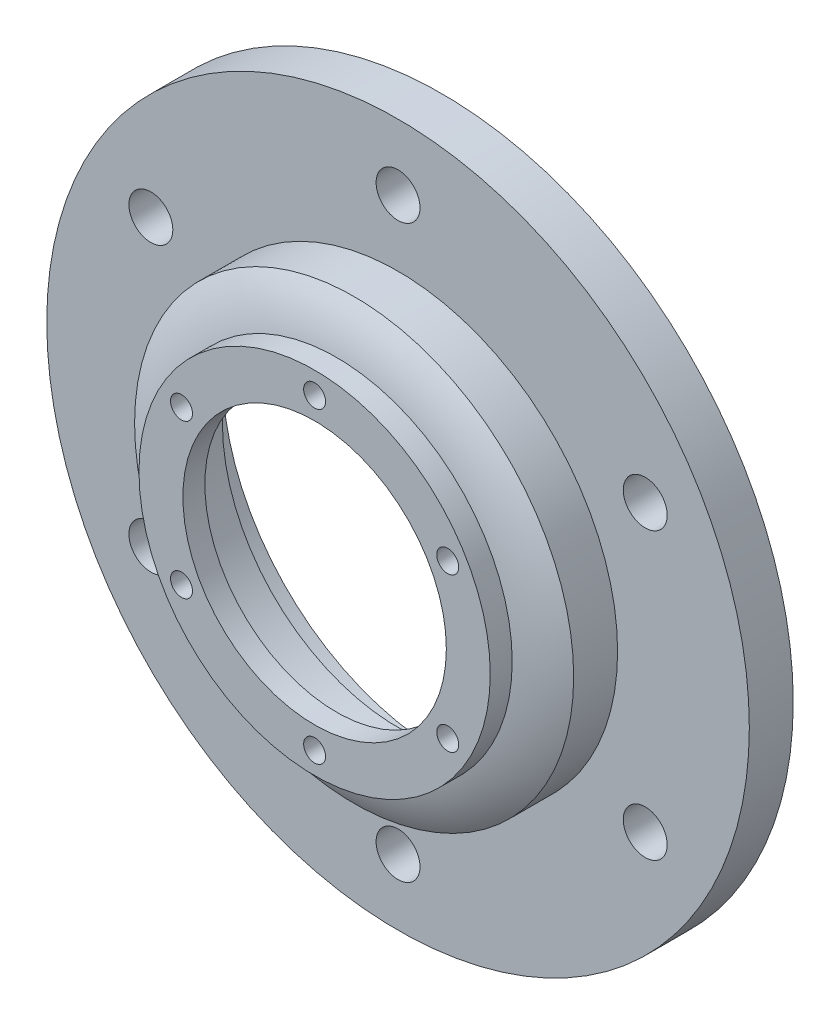
ISO-10303-21;
HEADER;
FILE_DESCRIPTION(('STEP AP214'),'2;1');
FILE_NAME('part.step','',(''),(''),'','','');
FILE_SCHEMA(('AUTOMOTIVE_DESIGN { 1 0 10303 214 1 1 1 1 }'));
ENDSEC;
DATA;
#1=APPLICATION_CONTEXT('core data for automotive mechanical design processes');
#2=APPLICATION_PROTOCOL_DEFINITION('international standard','automotive_design',2000,#1);
#3=PRODUCT_CONTEXT('',#1,'mechanical');
#4=PRODUCT('Part','Part','',(#3));
#5=PRODUCT_RELATED_PRODUCT_CATEGORY('part','',(#4));
#6=PRODUCT_DEFINITION_FORMATION('','',#4);
#7=PRODUCT_DEFINITION_CONTEXT('part definition',#1,'design');
#8=PRODUCT_DEFINITION('design','',#6,#7);
#9=PRODUCT_DEFINITION_SHAPE('','',#8);
#10=(LENGTH_UNIT() NAMED_UNIT(*) SI_UNIT(.MILLI.,.METRE.));
#11=(NAMED_UNIT(*) PLANE_ANGLE_UNIT() SI_UNIT($,.RADIAN.));
#12=(NAMED_UNIT(*) SI_UNIT($,.STERADIAN.) SOLID_ANGLE_UNIT());
#13=UNCERTAINTY_MEASURE_WITH_UNIT(LENGTH_MEASURE(1.E-05),#10,'distance_accuracy_value','');
#14=(GEOMETRIC_REPRESENTATION_CONTEXT(3) GLOBAL_UNCERTAINTY_ASSIGNED_CONTEXT((#13)) GLOBAL_UNIT_ASSIGNED_CONTEXT((#10,
#11,#12)) REPRESENTATION_CONTEXT('',''));
#15=CARTESIAN_POINT('',(0.,0.,0.));
#16=DIRECTION('',(0.,0.,1.));
#17=DIRECTION('',(1.,0.,0.));
#18=AXIS2_PLACEMENT_3D('',#15,#16,#17);
#19=CARTESIAN_POINT('',(0.,0.,29.));
#20=DIRECTION('',(0.,0.,1.));
#21=DIRECTION('',(1.,0.,0.));
#22=AXIS2_PLACEMENT_3D('',#19,#20,#21);
#23=PLANE('',#22);
#24=CARTESIAN_POINT('',(-30.3108891324552,17.5000000000004,29.));
#25=DIRECTION('',(0.,0.,1.));
#26=DIRECTION('',(1.,0.,0.));
#27=AXIS2_PLACEMENT_3D('',#24,#25,#26);
#28=CIRCLE('',#27,2.5);
#29=CARTESIAN_POINT('',(-27.8108891324551,17.5000000000004,29.));
#30=VERTEX_POINT('',#29);
#31=EDGE_CURVE('E97',#30,#30,#28,.T.);
#32=ORIENTED_EDGE('',*,*,#31,.F.);
#33=EDGE_LOOP('',(#32));
#34=FACE_BOUND('',#33,.T.);
#35=CARTESIAN_POINT('',(0.,35.,29.));
#36=DIRECTION('',(0.,0.,1.));
#37=DIRECTION('',(1.,0.,0.));
#38=AXIS2_PLACEMENT_3D('',#35,#36,#37);
#39=CIRCLE('',#38,2.5);
#40=CARTESIAN_POINT('',(2.5,35.,29.));
#41=VERTEX_POINT('',#40);
#42=EDGE_CURVE('E131',#41,#41,#39,.T.);
#43=ORIENTED_EDGE('',*,*,#42,.F.);
#44=EDGE_LOOP('',(#43));
#45=FACE_BOUND('',#44,.T.);
#46=CARTESIAN_POINT('',(30.3108891324554,17.4999999999999,29.));
#47=DIRECTION('',(0.,0.,1.));
#48=DIRECTION('',(1.,0.,0.));
#49=AXIS2_PLACEMENT_3D('',#46,#47,#48);
#50=CIRCLE('',#49,2.5);
#51=CARTESIAN_POINT('',(32.8108891324554,17.4999999999999,29.));
#52=VERTEX_POINT('',#51);
#53=EDGE_CURVE('E128',#52,#52,#50,.T.);
#54=ORIENTED_EDGE('',*,*,#53,.F.);
#55=EDGE_LOOP('',(#54));
#56=FACE_BOUND('',#55,.T.);
#57=CARTESIAN_POINT('',(30.3108891324553,-17.5000000000001,29.));
#58=DIRECTION('',(0.,0.,1.));
#59=DIRECTION('',(1.,0.,0.));
#60=AXIS2_PLACEMENT_3D('',#57,#58,#59);
#61=CIRCLE('',#60,2.5);
#62=CARTESIAN_POINT('',(32.8108891324553,-17.5000000000001,29.));
#63=VERTEX_POINT('',#62);
#64=EDGE_CURVE('E125',#63,#63,#61,.T.);
#65=ORIENTED_EDGE('',*,*,#64,.F.);
#66=EDGE_LOOP('',(#65));
#67=FACE_BOUND('',#66,.T.);
#68=CARTESIAN_POINT('',(-2.44403693719019E-13,-35.,29.));
#69=DIRECTION('',(0.,0.,1.));
#70=DIRECTION('',(1.,0.,0.));
#71=AXIS2_PLACEMENT_3D('',#68,#69,#70);
#72=CIRCLE('',#71,2.5);
#73=CARTESIAN_POINT('',(2.49999999999976,-35.,29.));
#74=VERTEX_POINT('',#73);
#75=EDGE_CURVE('E122',#74,#74,#72,.T.);
#76=ORIENTED_EDGE('',*,*,#75,.F.);
#77=EDGE_LOOP('',(#76));
#78=FACE_BOUND('',#77,.T.);
#79=CARTESIAN_POINT('',(-30.3108891324555,-17.4999999999997,29.));
#80=DIRECTION('',(0.,0.,1.));
#81=DIRECTION('',(1.,0.,0.));
#82=AXIS2_PLACEMENT_3D('',#79,#80,#81);
#83=CIRCLE('',#82,2.5);
#84=CARTESIAN_POINT('',(-27.8108891324555,-17.4999999999997,29.));
#85=VERTEX_POINT('',#84);
#86=EDGE_CURVE('E119',#85,#85,#83,.T.);
#87=ORIENTED_EDGE('',*,*,#86,.F.);
#88=EDGE_LOOP('',(#87));
#89=FACE_BOUND('',#88,.T.);
#90=CARTESIAN_POINT('',(0.,0.,29.));
#91=DIRECTION('',(0.,0.,1.));
#92=DIRECTION('',(1.,0.,0.));
#93=AXIS2_PLACEMENT_3D('',#90,#91,#92);
#94=CIRCLE('',#93,40.);
#95=CARTESIAN_POINT('',(40.,0.,29.));
#96=VERTEX_POINT('',#95);
#97=EDGE_CURVE('E12',#96,#96,#94,.T.);
#98=ORIENTED_EDGE('',*,*,#97,.T.);
#99=EDGE_LOOP('',(#98));
#100=FACE_BOUND('',#99,.T.);
#101=CARTESIAN_POINT('',(0.,0.,29.));
#102=DIRECTION('',(0.,0.,1.));
#103=DIRECTION('',(1.,0.,0.));
#104=AXIS2_PLACEMENT_3D('',#101,#102,#103);
#105=CIRCLE('',#104,30.);
#106=CARTESIAN_POINT('',(30.,0.,29.));
#107=VERTEX_POINT('',#106);
#108=EDGE_CURVE('E87',#107,#107,#105,.T.);
#109=ORIENTED_EDGE('',*,*,#108,.F.);
#110=EDGE_LOOP('',(#109));
#111=FACE_BOUND('',#110,.T.);
#112=ADVANCED_FACE('F74',(#34,#45,#56,#67,#78,#89,#100,#111),#23,.T.);
#113=CARTESIAN_POINT('',(0.,0.,24.));
#114=DIRECTION('',(0.,0.,1.));
#115=DIRECTION('',(1.,0.,0.));
#116=AXIS2_PLACEMENT_3D('',#113,#114,#115);
#117=PLANE('',#116);
#118=CARTESIAN_POINT('',(-30.3108891324552,17.5000000000004,24.));
#119=DIRECTION('',(0.,0.,1.));
#120=DIRECTION('',(1.,0.,0.));
#121=AXIS2_PLACEMENT_3D('',#118,#119,#120);
#122=CIRCLE('',#121,2.5);
#123=CARTESIAN_POINT('',(-27.8108891324551,17.5000000000004,24.));
#124=VERTEX_POINT('',#123);
#125=EDGE_CURVE('E78',#124,#124,#122,.T.);
#126=ORIENTED_EDGE('',*,*,#125,.T.);
#127=EDGE_LOOP('',(#126));
#128=FACE_BOUND('',#127,.T.);
#129=CARTESIAN_POINT('',(0.,35.,24.));
#130=DIRECTION('',(0.,0.,1.));
#131=DIRECTION('',(1.,0.,0.));
#132=AXIS2_PLACEMENT_3D('',#129,#130,#131);
#133=CIRCLE('',#132,2.5);
#134=CARTESIAN_POINT('',(2.5,35.,24.));
#135=VERTEX_POINT('',#134);
#136=EDGE_CURVE('E105',#135,#135,#133,.T.);
#137=ORIENTED_EDGE('',*,*,#136,.T.);
#138=EDGE_LOOP('',(#137));
#139=FACE_BOUND('',#138,.T.);
#140=CARTESIAN_POINT('',(30.3108891324554,17.4999999999999,24.));
#141=DIRECTION('',(0.,0.,1.));
#142=DIRECTION('',(1.,0.,0.));
#143=AXIS2_PLACEMENT_3D('',#140,#141,#142);
#144=CIRCLE('',#143,2.5);
#145=CARTESIAN_POINT('',(32.8108891324554,17.4999999999999,24.));
#146=VERTEX_POINT('',#145);
#147=EDGE_CURVE('E103',#146,#146,#144,.T.);
#148=ORIENTED_EDGE('',*,*,#147,.T.);
#149=EDGE_LOOP('',(#148));
#150=FACE_BOUND('',#149,.T.);
#151=CARTESIAN_POINT('',(30.3108891324553,-17.5000000000001,24.));
#152=DIRECTION('',(0.,0.,1.));
#153=DIRECTION('',(1.,0.,0.));
#154=AXIS2_PLACEMENT_3D('',#151,#152,#153);
#155=CIRCLE('',#154,2.5);
#156=CARTESIAN_POINT('',(32.8108891324553,-17.5000000000001,24.));
#157=VERTEX_POINT('',#156);
#158=EDGE_CURVE('E100',#157,#157,#155,.T.);
#159=ORIENTED_EDGE('',*,*,#158,.T.);
#160=EDGE_LOOP('',(#159));
#161=FACE_BOUND('',#160,.T.);
#162=CARTESIAN_POINT('',(-2.44403693719019E-13,-35.,24.));
#163=DIRECTION('',(0.,0.,1.));
#164=DIRECTION('',(1.,0.,0.));
#165=AXIS2_PLACEMENT_3D('',#162,#163,#164);
#166=CIRCLE('',#165,2.5);
#167=CARTESIAN_POINT('',(2.49999999999976,-35.,24.));
#168=VERTEX_POINT('',#167);
#169=EDGE_CURVE('E96',#168,#168,#166,.T.);
#170=ORIENTED_EDGE('',*,*,#169,.T.);
#171=EDGE_LOOP('',(#170));
#172=FACE_BOUND('',#171,.T.);
#173=CARTESIAN_POINT('',(-30.3108891324555,-17.4999999999997,24.));
#174=DIRECTION('',(0.,0.,1.));
#175=DIRECTION('',(1.,0.,0.));
#176=AXIS2_PLACEMENT_3D('',#173,#174,#175);
#177=CIRCLE('',#176,2.5);
#178=CARTESIAN_POINT('',(-27.8108891324555,-17.4999999999997,24.));
#179=VERTEX_POINT('',#178);
#180=EDGE_CURVE('E93',#179,#179,#177,.T.);
#181=ORIENTED_EDGE('',*,*,#180,.T.);
#182=EDGE_LOOP('',(#181));
#183=FACE_BOUND('',#182,.T.);
#184=CARTESIAN_POINT('',(0.,0.,24.));
#185=DIRECTION('',(0.,0.,1.));
#186=DIRECTION('',(1.,0.,0.));
#187=AXIS2_PLACEMENT_3D('',#184,#185,#186);
#188=CIRCLE('',#187,40.);
#189=CARTESIAN_POINT('',(40.,0.,24.));
#190=VERTEX_POINT('',#189);
#191=EDGE_CURVE('E82',#190,#190,#188,.T.);
#192=ORIENTED_EDGE('',*,*,#191,.F.);
#193=EDGE_LOOP('',(#192));
#194=FACE_BOUND('',#193,.T.);
#195=CARTESIAN_POINT('',(0.,0.,24.));
#196=DIRECTION('',(0.,0.,1.));
#197=DIRECTION('',(1.,0.,0.));
#198=AXIS2_PLACEMENT_3D('',#195,#196,#197);
#199=CIRCLE('',#198,30.);
#200=CARTESIAN_POINT('',(30.,0.,24.));
#201=VERTEX_POINT('',#200);
#202=EDGE_CURVE('E90',#201,#201,#199,.T.);
#203=ORIENTED_EDGE('',*,*,#202,.T.);
#204=EDGE_LOOP('',(#203));
#205=FACE_BOUND('',#204,.T.);
#206=ADVANCED_FACE('F142',(#128,#139,#150,#161,#172,#183,#194,#205),#117,.F.);
#207=CARTESIAN_POINT('',(0.,0.,29.));
#208=DIRECTION('',(0.,0.,-1.));
#209=DIRECTION('',(-1.,0.,0.));
#210=AXIS2_PLACEMENT_3D('',#207,#208,#209);
#211=CYLINDRICAL_SURFACE('',#210,40.);
#212=ORIENTED_EDGE('',*,*,#97,.F.);
#213=EDGE_LOOP('',(#212));
#214=FACE_BOUND('',#213,.T.);
#215=ORIENTED_EDGE('',*,*,#191,.T.);
#216=EDGE_LOOP('',(#215));
#217=FACE_BOUND('',#216,.T.);
#218=ADVANCED_FACE('F76',(#214,#217),#211,.T.);
#219=CARTESIAN_POINT('',(0.,0.,29.));
#220=DIRECTION('',(0.,0.,-1.));
#221=DIRECTION('',(-1.,0.,0.));
#222=AXIS2_PLACEMENT_3D('',#219,#220,#221);
#223=CYLINDRICAL_SURFACE('',#222,30.);
#224=ORIENTED_EDGE('',*,*,#108,.T.);
#225=EDGE_LOOP('',(#224));
#226=FACE_BOUND('',#225,.T.);
#227=ORIENTED_EDGE('',*,*,#202,.F.);
#228=EDGE_LOOP('',(#227));
#229=FACE_BOUND('',#228,.T.);
#230=ADVANCED_FACE('F159',(#226,#229),#223,.F.);
#231=CARTESIAN_POINT('',(-30.3108891324555,-17.4999999999997,0.));
#232=DIRECTION('',(0.,0.,1.));
#233=DIRECTION('',(1.,0.,0.));
#234=AXIS2_PLACEMENT_3D('',#231,#232,#233);
#235=CYLINDRICAL_SURFACE('',#234,2.5);
#236=ORIENTED_EDGE('',*,*,#86,.T.);
#237=EDGE_LOOP('',(#236));
#238=FACE_BOUND('',#237,.T.);
#239=ORIENTED_EDGE('',*,*,#180,.F.);
#240=EDGE_LOOP('',(#239));
#241=FACE_BOUND('',#240,.T.);
#242=ADVANCED_FACE('F155',(#238,#241),#235,.F.);
#243=CARTESIAN_POINT('',(-2.44403693719019E-13,-35.,0.));
#244=DIRECTION('',(0.,0.,1.));
#245=DIRECTION('',(1.,0.,0.));
#246=AXIS2_PLACEMENT_3D('',#243,#244,#245);
#247=CYLINDRICAL_SURFACE('',#246,2.5);
#248=ORIENTED_EDGE('',*,*,#75,.T.);
#249=EDGE_LOOP('',(#248));
#250=FACE_BOUND('',#249,.T.);
#251=ORIENTED_EDGE('',*,*,#169,.F.);
#252=EDGE_LOOP('',(#251));
#253=FACE_BOUND('',#252,.T.);
#254=ADVANCED_FACE('F158',(#250,#253),#247,.F.);
#255=CARTESIAN_POINT('',(30.3108891324553,-17.5000000000001,0.));
#256=DIRECTION('',(0.,0.,1.));
#257=DIRECTION('',(1.,0.,0.));
#258=AXIS2_PLACEMENT_3D('',#255,#256,#257);
#259=CYLINDRICAL_SURFACE('',#258,2.5);
#260=ORIENTED_EDGE('',*,*,#64,.T.);
#261=EDGE_LOOP('',(#260));
#262=FACE_BOUND('',#261,.T.);
#263=ORIENTED_EDGE('',*,*,#158,.F.);
#264=EDGE_LOOP('',(#263));
#265=FACE_BOUND('',#264,.T.);
#266=ADVANCED_FACE('F179',(#262,#265),#259,.F.);
#267=CARTESIAN_POINT('',(30.3108891324554,17.4999999999999,0.));
#268=DIRECTION('',(0.,0.,1.));
#269=DIRECTION('',(1.,0.,0.));
#270=AXIS2_PLACEMENT_3D('',#267,#268,#269);
#271=CYLINDRICAL_SURFACE('',#270,2.5);
#272=ORIENTED_EDGE('',*,*,#53,.T.);
#273=EDGE_LOOP('',(#272));
#274=FACE_BOUND('',#273,.T.);
#275=ORIENTED_EDGE('',*,*,#147,.F.);
#276=EDGE_LOOP('',(#275));
#277=FACE_BOUND('',#276,.T.);
#278=ADVANCED_FACE('F183',(#274,#277),#271,.F.);
#279=CARTESIAN_POINT('',(0.,35.,0.));
#280=DIRECTION('',(0.,0.,1.));
#281=DIRECTION('',(1.,0.,0.));
#282=AXIS2_PLACEMENT_3D('',#279,#280,#281);
#283=CYLINDRICAL_SURFACE('',#282,2.5);
#284=ORIENTED_EDGE('',*,*,#42,.T.);
#285=EDGE_LOOP('',(#284));
#286=FACE_BOUND('',#285,.T.);
#287=ORIENTED_EDGE('',*,*,#136,.F.);
#288=EDGE_LOOP('',(#287));
#289=FACE_BOUND('',#288,.T.);
#290=ADVANCED_FACE('F187',(#286,#289),#283,.F.);
#291=CARTESIAN_POINT('',(-30.3108891324552,17.5000000000004,0.));
#292=DIRECTION('',(0.,0.,1.));
#293=DIRECTION('',(1.,0.,0.));
#294=AXIS2_PLACEMENT_3D('',#291,#292,#293);
#295=CYLINDRICAL_SURFACE('',#294,2.5);
#296=ORIENTED_EDGE('',*,*,#31,.T.);
#297=EDGE_LOOP('',(#296));
#298=FACE_BOUND('',#297,.T.);
#299=ORIENTED_EDGE('',*,*,#125,.F.);
#300=EDGE_LOOP('',(#299));
#301=FACE_BOUND('',#300,.T.);
#302=ADVANCED_FACE('F137',(#298,#301),#295,.F.);
#303=CLOSED_SHELL('',(#112,#206,#218,#230,#242,#254,#266,#278,#290,#302));
#304=MANIFOLD_SOLID_BREP('B2',#303);
#305=CARTESIAN_POINT('',(0.,0.,10.));
#306=DIRECTION('',(0.,0.,1.));
#307=DIRECTION('',(1.,0.,0.));
#308=AXIS2_PLACEMENT_3D('',#305,#306,#307);
#309=PLANE('',#308);
#310=CARTESIAN_POINT('',(0.,0.,10.));
#311=DIRECTION('',(0.,0.,1.));
#312=DIRECTION('',(1.,0.,0.));
#313=AXIS2_PLACEMENT_3D('',#310,#311,#312);
#314=CIRCLE('',#313,50.);
#315=CARTESIAN_POINT('',(50.,0.,10.));
#316=VERTEX_POINT('',#315);
#317=EDGE_CURVE('E313',#316,#316,#314,.T.);
#318=ORIENTED_EDGE('',*,*,#317,.F.);
#319=EDGE_LOOP('',(#318));
#320=FACE_BOUND('',#319,.T.);
#321=CARTESIAN_POINT('',(0.,0.,10.));
#322=DIRECTION('',(0.,0.,1.));
#323=DIRECTION('',(1.,0.,0.));
#324=AXIS2_PLACEMENT_3D('',#321,#322,#323);
#325=CIRCLE('',#324,40.);
#326=CARTESIAN_POINT('',(40.,0.,10.));
#327=VERTEX_POINT('',#326);
#328=EDGE_CURVE('E320',#327,#327,#325,.T.);
#329=ORIENTED_EDGE('',*,*,#328,.T.);
#330=EDGE_LOOP('',(#329));
#331=FACE_BOUND('',#330,.T.);
#332=ADVANCED_FACE('F309',(#320,#331),#309,.F.);
#333=CARTESIAN_POINT('',(0.,0.,20.));
#334=DIRECTION('',(0.,0.,-1.));
#335=DIRECTION('',(-1.,0.,0.));
#336=AXIS2_PLACEMENT_3D('',#333,#334,#335);
#337=CYLINDRICAL_SURFACE('',#336,50.);
#338=CARTESIAN_POINT('',(0.,0.,20.));
#339=DIRECTION('',(0.,0.,1.));
#340=DIRECTION('',(1.,0.,0.));
#341=AXIS2_PLACEMENT_3D('',#338,#339,#340);
#342=CIRCLE('',#341,50.);
#343=CARTESIAN_POINT('',(50.,0.,20.));
#344=VERTEX_POINT('',#343);
#345=EDGE_CURVE('E73',#344,#344,#342,.T.);
#346=ORIENTED_EDGE('',*,*,#345,.F.);
#347=EDGE_LOOP('',(#346));
#348=FACE_BOUND('',#347,.T.);
#349=ORIENTED_EDGE('',*,*,#317,.T.);
#350=EDGE_LOOP('',(#349));
#351=FACE_BOUND('',#350,.T.);
#352=ADVANCED_FACE('F311',(#348,#351),#337,.T.);
#353=CARTESIAN_POINT('',(0.,0.,20.));
#354=DIRECTION('',(0.,0.,-1.));
#355=DIRECTION('',(-1.,0.,0.));
#356=AXIS2_PLACEMENT_3D('',#353,#354,#355);
#357=CYLINDRICAL_SURFACE('',#356,40.);
#358=ORIENTED_EDGE('',*,*,#328,.F.);
#359=EDGE_LOOP('',(#358));
#360=FACE_BOUND('',#359,.T.);
#361=CARTESIAN_POINT('',(0.,0.,24.));
#362=DIRECTION('',(0.,0.,-1.));
#363=DIRECTION('',(-1.,0.,0.));
#364=AXIS2_PLACEMENT_3D('',#361,#362,#363);
#365=CIRCLE('',#364,40.);
#366=CARTESIAN_POINT('',(-40.,0.,24.));
#367=VERTEX_POINT('',#366);
#368=EDGE_CURVE('E324',#367,#367,#365,.T.);
#369=ORIENTED_EDGE('',*,*,#368,.F.);
#370=EDGE_LOOP('',(#369));
#371=FACE_BOUND('',#370,.T.);
#372=ADVANCED_FACE('F337',(#360,#371),#357,.F.);
#373=CARTESIAN_POINT('',(0.,50.,20.));
#374=CARTESIAN_POINT('',(0.,45.3815767008459,22.9364972078691));
#375=CARTESIAN_POINT('',(0.,40.,24.));
#376=B_SPLINE_CURVE_WITH_KNOTS('',2,(#373,#374,#375),.UNSPECIFIED.,.F.,.F.,(3,3),(0.,1.),.UNSPECIFIED.);
#377=CARTESIAN_POINT('',(0.,0.,0.));
#378=DIRECTION('',(0.,0.,-1.));
#379=AXIS1_PLACEMENT('',#377,#378);
#380=SURFACE_OF_REVOLUTION('',#376,#379);
#381=ORIENTED_EDGE('',*,*,#368,.T.);
#382=EDGE_LOOP('',(#381));
#383=FACE_BOUND('',#382,.T.);
#384=ORIENTED_EDGE('',*,*,#345,.T.);
#385=EDGE_LOOP('',(#384));
#386=FACE_BOUND('',#385,.T.);
#387=ADVANCED_FACE('F334',(#383,#386),#380,.F.);
#388=CLOSED_SHELL('',(#332,#352,#372,#387));
#389=MANIFOLD_SOLID_BREP('B7',#388);
#390=CARTESIAN_POINT('',(0.,0.,10.));
#391=DIRECTION('',(0.,0.,1.));
#392=DIRECTION('',(1.,0.,0.));
#393=AXIS2_PLACEMENT_3D('',#390,#391,#392);
#394=PLANE('',#393);
#395=CARTESIAN_POINT('',(-56.291651245987,-32.5000000000026,10.));
#396=DIRECTION('',(0.,0.,1.));
#397=DIRECTION('',(1.,0.,0.));
#398=AXIS2_PLACEMENT_3D('',#395,#396,#397);
#399=CIRCLE('',#398,5.0000000000034);
#400=CARTESIAN_POINT('',(-51.2916512459836,-32.5000000000026,10.));
#401=VERTEX_POINT('',#400);
#402=EDGE_CURVE('E448',#401,#401,#399,.T.);
#403=ORIENTED_EDGE('',*,*,#402,.F.);
#404=EDGE_LOOP('',(#403));
#405=FACE_BOUND('',#404,.T.);
#406=CARTESIAN_POINT('',(4.77542611851109E-12,-65.0000000000032,10.));
#407=DIRECTION('',(0.,0.,1.));
#408=DIRECTION('',(1.,0.,0.));
#409=AXIS2_PLACEMENT_3D('',#406,#407,#408);
#410=CIRCLE('',#409,5.00000000000407);
#411=CARTESIAN_POINT('',(5.00000000000885,-65.0000000000032,10.));
#412=VERTEX_POINT('',#411);
#413=EDGE_CURVE('E433',#412,#412,#410,.T.);
#414=ORIENTED_EDGE('',*,*,#413,.F.);
#415=EDGE_LOOP('',(#414));
#416=FACE_BOUND('',#415,.T.);
#417=CARTESIAN_POINT('',(2.59033772081058E-12,65.0000000000032,10.));
#418=DIRECTION('',(0.,0.,1.));
#419=DIRECTION('',(1.,0.,0.));
#420=AXIS2_PLACEMENT_3D('',#417,#418,#419);
#421=CIRCLE('',#420,4.99999999999659);
#422=CARTESIAN_POINT('',(4.99999999999918,65.0000000000032,10.));
#423=VERTEX_POINT('',#422);
#424=EDGE_CURVE('E432',#423,#423,#421,.T.);
#425=ORIENTED_EDGE('',*,*,#424,.F.);
#426=EDGE_LOOP('',(#425));
#427=FACE_BOUND('',#426,.T.);
#428=CARTESIAN_POINT('',(56.2916512459955,-32.5000000000006,10.));
#429=DIRECTION('',(0.,0.,1.));
#430=DIRECTION('',(1.,0.,0.));
#431=AXIS2_PLACEMENT_3D('',#428,#429,#430);
#432=CIRCLE('',#431,5.00000000000124);
#433=CARTESIAN_POINT('',(61.2916512459968,-32.5000000000006,10.));
#434=VERTEX_POINT('',#433);
#435=EDGE_CURVE('E424',#434,#434,#432,.T.);
#436=ORIENTED_EDGE('',*,*,#435,.F.);
#437=EDGE_LOOP('',(#436));
#438=FACE_BOUND('',#437,.T.);
#439=CARTESIAN_POINT('',(-56.2916512459881,32.5000000000007,10.));
#440=DIRECTION('',(0.,0.,1.));
#441=DIRECTION('',(1.,0.,0.));
#442=AXIS2_PLACEMENT_3D('',#439,#440,#441);
#443=CIRCLE('',#442,5.00000000000001);
#444=CARTESIAN_POINT('',(-51.2916512459881,32.5000000000007,10.));
#445=VERTEX_POINT('',#444);
#446=EDGE_CURVE('E449',#445,#445,#443,.T.);
#447=ORIENTED_EDGE('',*,*,#446,.F.);
#448=EDGE_LOOP('',(#447));
#449=FACE_BOUND('',#448,.T.);
#450=CARTESIAN_POINT('',(56.2916512459944,32.5000000000026,10.));
#451=DIRECTION('',(0.,0.,1.));
#452=DIRECTION('',(1.,0.,0.));
#453=AXIS2_PLACEMENT_3D('',#450,#451,#452);
#454=CIRCLE('',#453,4.99999999999757);
#455=CARTESIAN_POINT('',(61.291651245992,32.5000000000026,10.));
#456=VERTEX_POINT('',#455);
#457=EDGE_CURVE('E420',#456,#456,#454,.T.);
#458=ORIENTED_EDGE('',*,*,#457,.F.);
#459=EDGE_LOOP('',(#458));
#460=FACE_BOUND('',#459,.T.);
#461=CARTESIAN_POINT('',(0.,0.,10.));
#462=DIRECTION('',(0.,0.,1.));
#463=DIRECTION('',(1.,0.,0.));
#464=AXIS2_PLACEMENT_3D('',#461,#462,#463);
#465=CIRCLE('',#464,80.);
#466=CARTESIAN_POINT('',(80.,0.,10.));
#467=VERTEX_POINT('',#466);
#468=EDGE_CURVE('E308',#467,#467,#465,.T.);
#469=ORIENTED_EDGE('',*,*,#468,.T.);
#470=EDGE_LOOP('',(#469));
#471=FACE_BOUND('',#470,.T.);
#472=CARTESIAN_POINT('',(0.,0.,10.));
#473=DIRECTION('',(0.,0.,1.));
#474=DIRECTION('',(1.,0.,0.));
#475=AXIS2_PLACEMENT_3D('',#472,#473,#474);
#476=CIRCLE('',#475,50.);
#477=CARTESIAN_POINT('',(50.,0.,10.));
#478=VERTEX_POINT('',#477);
#479=EDGE_CURVE('E410',#478,#478,#476,.T.);
#480=ORIENTED_EDGE('',*,*,#479,.F.);
#481=EDGE_LOOP('',(#480));
#482=FACE_BOUND('',#481,.T.);
#483=ADVANCED_FACE('F397',(#405,#416,#427,#438,#449,#460,#471,#482),#394,.T.);
#484=CARTESIAN_POINT('',(0.,0.,0.));
#485=DIRECTION('',(0.,0.,1.));
#486=DIRECTION('',(1.,0.,0.));
#487=AXIS2_PLACEMENT_3D('',#484,#485,#486);
#488=PLANE('',#487);
#489=CARTESIAN_POINT('',(-56.291651245987,-32.5000000000026,0.));
#490=DIRECTION('',(0.,0.,1.));
#491=DIRECTION('',(1.,0.,0.));
#492=AXIS2_PLACEMENT_3D('',#489,#490,#491);
#493=CIRCLE('',#492,5.0000000000034);
#494=CARTESIAN_POINT('',(-51.2916512459836,-32.5000000000026,0.));
#495=VERTEX_POINT('',#494);
#496=EDGE_CURVE('E444',#495,#495,#493,.T.);
#497=ORIENTED_EDGE('',*,*,#496,.T.);
#498=EDGE_LOOP('',(#497));
#499=FACE_BOUND('',#498,.T.);
#500=CARTESIAN_POINT('',(4.77542611851109E-12,-65.0000000000032,0.));
#501=DIRECTION('',(0.,0.,1.));
#502=DIRECTION('',(1.,0.,0.));
#503=AXIS2_PLACEMENT_3D('',#500,#501,#502);
#504=CIRCLE('',#503,5.00000000000407);
#505=CARTESIAN_POINT('',(5.00000000000885,-65.0000000000032,0.));
#506=VERTEX_POINT('',#505);
#507=EDGE_CURVE('E453',#506,#506,#504,.T.);
#508=ORIENTED_EDGE('',*,*,#507,.T.);
#509=EDGE_LOOP('',(#508));
#510=FACE_BOUND('',#509,.T.);
#511=CARTESIAN_POINT('',(2.59033772081058E-12,65.0000000000032,0.));
#512=DIRECTION('',(0.,0.,1.));
#513=DIRECTION('',(1.,0.,0.));
#514=AXIS2_PLACEMENT_3D('',#511,#512,#513);
#515=CIRCLE('',#514,4.99999999999659);
#516=CARTESIAN_POINT('',(4.99999999999918,65.0000000000032,0.));
#517=VERTEX_POINT('',#516);
#518=EDGE_CURVE('E428',#517,#517,#515,.T.);
#519=ORIENTED_EDGE('',*,*,#518,.T.);
#520=EDGE_LOOP('',(#519));
#521=FACE_BOUND('',#520,.T.);
#522=CARTESIAN_POINT('',(56.2916512459955,-32.5000000000006,0.));
#523=DIRECTION('',(0.,0.,1.));
#524=DIRECTION('',(1.,0.,0.));
#525=AXIS2_PLACEMENT_3D('',#522,#523,#524);
#526=CIRCLE('',#525,5.00000000000124);
#527=CARTESIAN_POINT('',(61.2916512459968,-32.5000000000006,0.));
#528=VERTEX_POINT('',#527);
#529=EDGE_CURVE('E437',#528,#528,#526,.T.);
#530=ORIENTED_EDGE('',*,*,#529,.T.);
#531=EDGE_LOOP('',(#530));
#532=FACE_BOUND('',#531,.T.);
#533=CARTESIAN_POINT('',(-56.2916512459881,32.5000000000007,0.));
#534=DIRECTION('',(0.,0.,1.));
#535=DIRECTION('',(1.,0.,0.));
#536=AXIS2_PLACEMENT_3D('',#533,#534,#535);
#537=CIRCLE('',#536,5.00000000000001);
#538=CARTESIAN_POINT('',(-51.2916512459881,32.5000000000007,0.));
#539=VERTEX_POINT('',#538);
#540=EDGE_CURVE('E460',#539,#539,#537,.T.);
#541=ORIENTED_EDGE('',*,*,#540,.T.);
#542=EDGE_LOOP('',(#541));
#543=FACE_BOUND('',#542,.T.);
#544=CARTESIAN_POINT('',(56.2916512459944,32.5000000000026,0.));
#545=DIRECTION('',(0.,0.,1.));
#546=DIRECTION('',(1.,0.,0.));
#547=AXIS2_PLACEMENT_3D('',#544,#545,#546);
#548=CIRCLE('',#547,4.99999999999757);
#549=CARTESIAN_POINT('',(61.291651245992,32.5000000000026,0.));
#550=VERTEX_POINT('',#549);
#551=EDGE_CURVE('E416',#550,#550,#548,.T.);
#552=ORIENTED_EDGE('',*,*,#551,.T.);
#553=EDGE_LOOP('',(#552));
#554=FACE_BOUND('',#553,.T.);
#555=CARTESIAN_POINT('',(0.,0.,0.));
#556=DIRECTION('',(0.,0.,1.));
#557=DIRECTION('',(1.,0.,0.));
#558=AXIS2_PLACEMENT_3D('',#555,#556,#557);
#559=CIRCLE('',#558,80.);
#560=CARTESIAN_POINT('',(80.,0.,0.));
#561=VERTEX_POINT('',#560);
#562=EDGE_CURVE('E401',#561,#561,#559,.T.);
#563=ORIENTED_EDGE('',*,*,#562,.F.);
#564=EDGE_LOOP('',(#563));
#565=FACE_BOUND('',#564,.T.);
#566=CARTESIAN_POINT('',(0.,0.,0.));
#567=DIRECTION('',(0.,0.,1.));
#568=DIRECTION('',(1.,0.,0.));
#569=AXIS2_PLACEMENT_3D('',#566,#567,#568);
#570=CIRCLE('',#569,50.);
#571=CARTESIAN_POINT('',(50.,0.,0.));
#572=VERTEX_POINT('',#571);
#573=EDGE_CURVE('E412',#572,#572,#570,.T.);
#574=ORIENTED_EDGE('',*,*,#573,.T.);
#575=EDGE_LOOP('',(#574));
#576=FACE_BOUND('',#575,.T.);
#577=ADVANCED_FACE('F472',(#499,#510,#521,#532,#543,#554,#565,#576),#488,.F.);
#578=CARTESIAN_POINT('',(0.,0.,10.));
#579=DIRECTION('',(0.,0.,-1.));
#580=DIRECTION('',(-1.,0.,0.));
#581=AXIS2_PLACEMENT_3D('',#578,#579,#580);
#582=CYLINDRICAL_SURFACE('',#581,80.);
#583=ORIENTED_EDGE('',*,*,#468,.F.);
#584=EDGE_LOOP('',(#583));
#585=FACE_BOUND('',#584,.T.);
#586=ORIENTED_EDGE('',*,*,#562,.T.);
#587=EDGE_LOOP('',(#586));
#588=FACE_BOUND('',#587,.T.);
#589=ADVANCED_FACE('F399',(#585,#588),#582,.T.);
#590=CARTESIAN_POINT('',(0.,0.,10.));
#591=DIRECTION('',(0.,0.,-1.));
#592=DIRECTION('',(-1.,0.,0.));
#593=AXIS2_PLACEMENT_3D('',#590,#591,#592);
#594=CYLINDRICAL_SURFACE('',#593,50.);
#595=ORIENTED_EDGE('',*,*,#479,.T.);
#596=EDGE_LOOP('',(#595));
#597=FACE_BOUND('',#596,.T.);
#598=ORIENTED_EDGE('',*,*,#573,.F.);
#599=EDGE_LOOP('',(#598));
#600=FACE_BOUND('',#599,.T.);
#601=ADVANCED_FACE('F479',(#597,#600),#594,.F.);
#602=CARTESIAN_POINT('',(56.2916512459944,32.5000000000026,0.));
#603=DIRECTION('',(0.,0.,1.));
#604=DIRECTION('',(1.,0.,0.));
#605=AXIS2_PLACEMENT_3D('',#602,#603,#604);
#606=CYLINDRICAL_SURFACE('',#605,4.99999999999757);
#607=ORIENTED_EDGE('',*,*,#551,.F.);
#608=EDGE_LOOP('',(#607));
#609=FACE_BOUND('',#608,.T.);
#610=ORIENTED_EDGE('',*,*,#457,.T.);
#611=EDGE_LOOP('',(#610));
#612=FACE_BOUND('',#611,.T.);
#613=ADVANCED_FACE('F482',(#609,#612),#606,.F.);
#614=CARTESIAN_POINT('',(-56.2916512459881,32.5000000000007,0.));
#615=DIRECTION('',(0.,0.,1.));
#616=DIRECTION('',(1.,0.,0.));
#617=AXIS2_PLACEMENT_3D('',#614,#615,#616);
#618=CYLINDRICAL_SURFACE('',#617,5.00000000000001);
#619=ORIENTED_EDGE('',*,*,#540,.F.);
#620=EDGE_LOOP('',(#619));
#621=FACE_BOUND('',#620,.T.);
#622=ORIENTED_EDGE('',*,*,#446,.T.);
#623=EDGE_LOOP('',(#622));
#624=FACE_BOUND('',#623,.T.);
#625=ADVANCED_FACE('F468',(#621,#624),#618,.F.);
#626=CARTESIAN_POINT('',(56.2916512459955,-32.5000000000006,0.));
#627=DIRECTION('',(0.,0.,1.));
#628=DIRECTION('',(1.,0.,0.));
#629=AXIS2_PLACEMENT_3D('',#626,#627,#628);
#630=CYLINDRICAL_SURFACE('',#629,5.00000000000124);
#631=ORIENTED_EDGE('',*,*,#529,.F.);
#632=EDGE_LOOP('',(#631));
#633=FACE_BOUND('',#632,.T.);
#634=ORIENTED_EDGE('',*,*,#435,.T.);
#635=EDGE_LOOP('',(#634));
#636=FACE_BOUND('',#635,.T.);
#637=ADVANCED_FACE('F501',(#633,#636),#630,.F.);
#638=CARTESIAN_POINT('',(2.59033772081058E-12,65.0000000000032,0.));
#639=DIRECTION('',(0.,0.,1.));
#640=DIRECTION('',(1.,0.,0.));
#641=AXIS2_PLACEMENT_3D('',#638,#639,#640);
#642=CYLINDRICAL_SURFACE('',#641,4.99999999999659);
#643=ORIENTED_EDGE('',*,*,#518,.F.);
#644=EDGE_LOOP('',(#643));
#645=FACE_BOUND('',#644,.T.);
#646=ORIENTED_EDGE('',*,*,#424,.T.);
#647=EDGE_LOOP('',(#646));
#648=FACE_BOUND('',#647,.T.);
#649=ADVANCED_FACE('F497',(#645,#648),#642,.F.);
#650=CARTESIAN_POINT('',(4.77542611851109E-12,-65.0000000000032,0.));
#651=DIRECTION('',(0.,0.,1.));
#652=DIRECTION('',(1.,0.,0.));
#653=AXIS2_PLACEMENT_3D('',#650,#651,#652);
#654=CYLINDRICAL_SURFACE('',#653,5.00000000000407);
#655=ORIENTED_EDGE('',*,*,#507,.F.);
#656=EDGE_LOOP('',(#655));
#657=FACE_BOUND('',#656,.T.);
#658=ORIENTED_EDGE('',*,*,#413,.T.);
#659=EDGE_LOOP('',(#658));
#660=FACE_BOUND('',#659,.T.);
#661=ADVANCED_FACE('F500',(#657,#660),#654,.F.);
#662=CARTESIAN_POINT('',(-56.291651245987,-32.5000000000026,0.));
#663=DIRECTION('',(0.,0.,1.));
#664=DIRECTION('',(1.,0.,0.));
#665=AXIS2_PLACEMENT_3D('',#662,#663,#664);
#666=CYLINDRICAL_SURFACE('',#665,5.0000000000034);
#667=ORIENTED_EDGE('',*,*,#496,.F.);
#668=EDGE_LOOP('',(#667));
#669=FACE_BOUND('',#668,.T.);
#670=ORIENTED_EDGE('',*,*,#402,.T.);
#671=EDGE_LOOP('',(#670));
#672=FACE_BOUND('',#671,.T.);
#673=ADVANCED_FACE('F506',(#669,#672),#666,.F.);
#674=CLOSED_SHELL('',(#483,#577,#589,#601,#613,#625,#637,#649,#661,#673));
#675=MANIFOLD_SOLID_BREP('B68',#674);
#676=ADVANCED_BREP_SHAPE_REPRESENTATION('',(#18,#304,#389,#675),#14);
#677=SHAPE_DEFINITION_REPRESENTATION(#9,#676);
ENDSEC;
END-ISO-10303-21;
